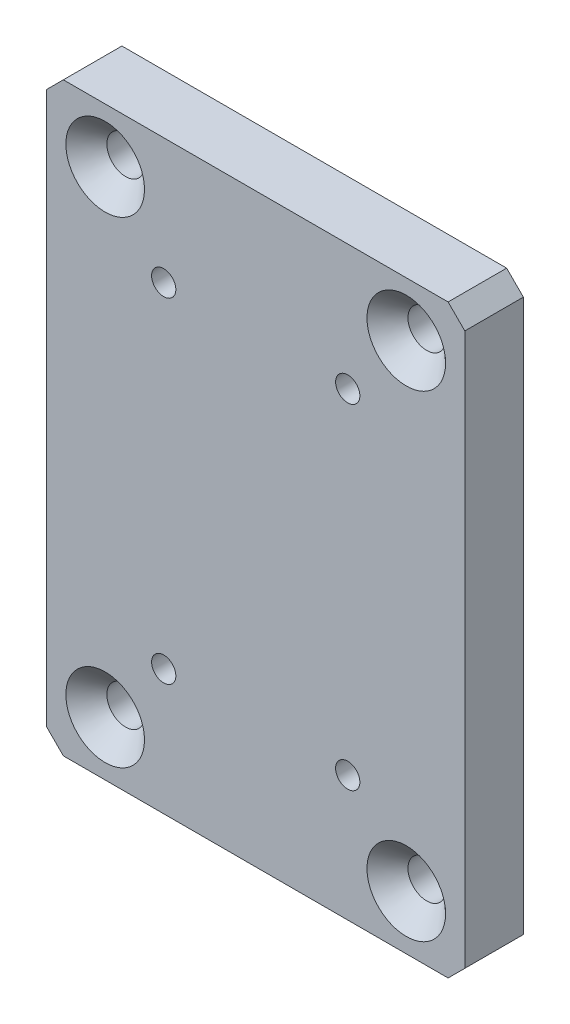
ISO-10303-21;
HEADER;
FILE_DESCRIPTION(('STEP AP214'),'2;1');
FILE_NAME('part.step','',(''),(''),'','','');
FILE_SCHEMA(('AUTOMOTIVE_DESIGN { 1 0 10303 214 1 1 1 1 }'));
ENDSEC;
DATA;
#1=APPLICATION_CONTEXT('core data for automotive mechanical design processes');
#2=APPLICATION_PROTOCOL_DEFINITION('international standard','automotive_design',2000,#1);
#3=PRODUCT_CONTEXT('',#1,'mechanical');
#4=PRODUCT('Part','Part','',(#3));
#5=PRODUCT_RELATED_PRODUCT_CATEGORY('part','',(#4));
#6=PRODUCT_DEFINITION_FORMATION('','',#4);
#7=PRODUCT_DEFINITION_CONTEXT('part definition',#1,'design');
#8=PRODUCT_DEFINITION('design','',#6,#7);
#9=PRODUCT_DEFINITION_SHAPE('','',#8);
#10=(LENGTH_UNIT() NAMED_UNIT(*) SI_UNIT(.MILLI.,.METRE.));
#11=(NAMED_UNIT(*) PLANE_ANGLE_UNIT() SI_UNIT($,.RADIAN.));
#12=(NAMED_UNIT(*) SI_UNIT($,.STERADIAN.) SOLID_ANGLE_UNIT());
#13=UNCERTAINTY_MEASURE_WITH_UNIT(LENGTH_MEASURE(1.E-05),#10,'distance_accuracy_value','');
#14=(GEOMETRIC_REPRESENTATION_CONTEXT(3) GLOBAL_UNCERTAINTY_ASSIGNED_CONTEXT((#13)) GLOBAL_UNIT_ASSIGNED_CONTEXT((#10,
#11,#12)) REPRESENTATION_CONTEXT('',''));
#15=CARTESIAN_POINT('',(0.,0.,0.));
#16=DIRECTION('',(0.,0.,1.));
#17=DIRECTION('',(1.,0.,0.));
#18=AXIS2_PLACEMENT_3D('',#15,#16,#17);
#19=CARTESIAN_POINT('',(0.,0.,7.));
#20=DIRECTION('',(0.,0.,1.));
#21=DIRECTION('',(1.,0.,0.));
#22=AXIS2_PLACEMENT_3D('',#19,#20,#21);
#23=PLANE('',#22);
#24=CARTESIAN_POINT('',(-11.,20.,7.));
#25=DIRECTION('',(0.,0.,-1.));
#26=DIRECTION('',(-1.,0.,0.));
#27=AXIS2_PLACEMENT_3D('',#24,#25,#26);
#28=CIRCLE('',#27,1.45);
#29=CARTESIAN_POINT('',(-12.45,20.,7.));
#30=VERTEX_POINT('',#29);
#31=EDGE_CURVE('E304',#30,#30,#28,.T.);
#32=ORIENTED_EDGE('',*,*,#31,.T.);
#33=EDGE_LOOP('',(#32));
#34=FACE_BOUND('',#33,.T.);
#35=CARTESIAN_POINT('',(11.,20.,7.));
#36=DIRECTION('',(0.,0.,-1.));
#37=DIRECTION('',(-1.,0.,0.));
#38=AXIS2_PLACEMENT_3D('',#35,#36,#37);
#39=CIRCLE('',#38,1.45);
#40=CARTESIAN_POINT('',(9.55,20.,7.));
#41=VERTEX_POINT('',#40);
#42=EDGE_CURVE('E288',#41,#41,#39,.T.);
#43=ORIENTED_EDGE('',*,*,#42,.T.);
#44=EDGE_LOOP('',(#43));
#45=FACE_BOUND('',#44,.T.);
#46=CARTESIAN_POINT('',(11.,-20.,7.));
#47=DIRECTION('',(0.,0.,-1.));
#48=DIRECTION('',(-1.,0.,0.));
#49=AXIS2_PLACEMENT_3D('',#46,#47,#48);
#50=CIRCLE('',#49,1.45);
#51=CARTESIAN_POINT('',(9.55,-20.,7.));
#52=VERTEX_POINT('',#51);
#53=EDGE_CURVE('E272',#52,#52,#50,.T.);
#54=ORIENTED_EDGE('',*,*,#53,.T.);
#55=EDGE_LOOP('',(#54));
#56=FACE_BOUND('',#55,.T.);
#57=CARTESIAN_POINT('',(-11.,-20.,7.));
#58=DIRECTION('',(0.,0.,-1.));
#59=DIRECTION('',(-1.,0.,0.));
#60=AXIS2_PLACEMENT_3D('',#57,#58,#59);
#61=CIRCLE('',#60,1.45);
#62=CARTESIAN_POINT('',(-12.45,-20.,7.));
#63=VERTEX_POINT('',#62);
#64=EDGE_CURVE('E256',#63,#63,#61,.T.);
#65=ORIENTED_EDGE('',*,*,#64,.T.);
#66=EDGE_LOOP('',(#65));
#67=FACE_BOUND('',#66,.T.);
#68=CARTESIAN_POINT('',(18.,28.5,7.));
#69=DIRECTION('',(0.,0.,1.));
#70=DIRECTION('',(1.,0.,0.));
#71=AXIS2_PLACEMENT_3D('',#68,#69,#70);
#72=CIRCLE('',#71,4.7);
#73=CARTESIAN_POINT('',(22.7,28.5,7.));
#74=VERTEX_POINT('',#73);
#75=EDGE_CURVE('E252',#74,#74,#72,.T.);
#76=ORIENTED_EDGE('',*,*,#75,.F.);
#77=EDGE_LOOP('',(#76));
#78=FACE_BOUND('',#77,.T.);
#79=CARTESIAN_POINT('',(18.,-28.5,7.));
#80=DIRECTION('',(0.,0.,1.));
#81=DIRECTION('',(1.,0.,0.));
#82=AXIS2_PLACEMENT_3D('',#79,#80,#81);
#83=CIRCLE('',#82,4.7);
#84=CARTESIAN_POINT('',(22.7,-28.5,7.));
#85=VERTEX_POINT('',#84);
#86=EDGE_CURVE('E240',#85,#85,#83,.T.);
#87=ORIENTED_EDGE('',*,*,#86,.F.);
#88=EDGE_LOOP('',(#87));
#89=FACE_BOUND('',#88,.T.);
#90=CARTESIAN_POINT('',(-18.,-28.5,7.));
#91=DIRECTION('',(0.,0.,1.));
#92=DIRECTION('',(1.,0.,0.));
#93=AXIS2_PLACEMENT_3D('',#90,#91,#92);
#94=CIRCLE('',#93,4.7);
#95=CARTESIAN_POINT('',(-13.3,-28.5,7.));
#96=VERTEX_POINT('',#95);
#97=EDGE_CURVE('E228',#96,#96,#94,.T.);
#98=ORIENTED_EDGE('',*,*,#97,.F.);
#99=EDGE_LOOP('',(#98));
#100=FACE_BOUND('',#99,.T.);
#101=CARTESIAN_POINT('',(-18.,28.5,7.));
#102=DIRECTION('',(0.,0.,1.));
#103=DIRECTION('',(1.,0.,0.));
#104=AXIS2_PLACEMENT_3D('',#101,#102,#103);
#105=CIRCLE('',#104,4.7);
#106=CARTESIAN_POINT('',(-13.3,28.5,7.));
#107=VERTEX_POINT('',#106);
#108=EDGE_CURVE('E216',#107,#107,#105,.T.);
#109=ORIENTED_EDGE('',*,*,#108,.F.);
#110=EDGE_LOOP('',(#109));
#111=FACE_BOUND('',#110,.T.);
#112=DIRECTION('',(0.,1.,0.));
#113=VECTOR('',#112,1.);
#114=CARTESIAN_POINT('',(25.,35.,7.));
#115=LINE('',#114,#113);
#116=CARTESIAN_POINT('',(25.,-33.,7.));
#117=VERTEX_POINT('',#116);
#118=CARTESIAN_POINT('',(25.,33.,7.));
#119=VERTEX_POINT('',#118);
#120=EDGE_CURVE('E203',#117,#119,#115,.T.);
#121=ORIENTED_EDGE('',*,*,#120,.T.);
#122=DIRECTION('',(0.707106781186545,-0.70710678118655,0.));
#123=VECTOR('',#122,1.);
#124=CARTESIAN_POINT('',(29.0000000000001,28.9999999999999,7.));
#125=LINE('',#124,#123);
#126=CARTESIAN_POINT('',(23.,35.,7.));
#127=VERTEX_POINT('',#126);
#128=EDGE_CURVE('E13',#119,#127,#125,.F.);
#129=ORIENTED_EDGE('',*,*,#128,.T.);
#130=DIRECTION('',(-1.,0.,0.));
#131=VECTOR('',#130,1.);
#132=CARTESIAN_POINT('',(-25.,35.,7.));
#133=LINE('',#132,#131);
#134=CARTESIAN_POINT('',(-23.,35.,7.));
#135=VERTEX_POINT('',#134);
#136=EDGE_CURVE('E140',#127,#135,#133,.T.);
#137=ORIENTED_EDGE('',*,*,#136,.T.);
#138=DIRECTION('',(0.707106781186547,0.707106781186548,0.));
#139=VECTOR('',#138,1.);
#140=CARTESIAN_POINT('',(-29.,29.,7.));
#141=LINE('',#140,#139);
#142=CARTESIAN_POINT('',(-25.,33.,7.));
#143=VERTEX_POINT('',#142);
#144=EDGE_CURVE('E167',#135,#143,#141,.F.);
#145=ORIENTED_EDGE('',*,*,#144,.T.);
#146=DIRECTION('',(0.,-1.,0.));
#147=VECTOR('',#146,1.);
#148=CARTESIAN_POINT('',(-25.,35.,7.));
#149=LINE('',#148,#147);
#150=CARTESIAN_POINT('',(-25.,-33.,7.));
#151=VERTEX_POINT('',#150);
#152=EDGE_CURVE('E138',#143,#151,#149,.T.);
#153=ORIENTED_EDGE('',*,*,#152,.T.);
#154=DIRECTION('',(-0.707106781186543,0.707106781186552,0.));
#155=VECTOR('',#154,1.);
#156=CARTESIAN_POINT('',(-29.0000000000002,-28.9999999999998,7.));
#157=LINE('',#156,#155);
#158=CARTESIAN_POINT('',(-23.,-35.,7.));
#159=VERTEX_POINT('',#158);
#160=EDGE_CURVE('E179',#151,#159,#157,.F.);
#161=ORIENTED_EDGE('',*,*,#160,.T.);
#162=DIRECTION('',(1.,0.,0.));
#163=VECTOR('',#162,1.);
#164=CARTESIAN_POINT('',(-25.,-35.,7.));
#165=LINE('',#164,#163);
#166=CARTESIAN_POINT('',(23.,-35.,7.));
#167=VERTEX_POINT('',#166);
#168=EDGE_CURVE('E205',#159,#167,#165,.T.);
#169=ORIENTED_EDGE('',*,*,#168,.T.);
#170=DIRECTION('',(-0.707106781186546,-0.707106781186549,0.));
#171=VECTOR('',#170,1.);
#172=CARTESIAN_POINT('',(29.,-28.9999999999999,7.));
#173=LINE('',#172,#171);
#174=EDGE_CURVE('E192',#167,#117,#173,.F.);
#175=ORIENTED_EDGE('',*,*,#174,.T.);
#176=EDGE_LOOP('',(#121,#129,#137,#145,#153,#161,#169,#175));
#177=FACE_BOUND('',#176,.T.);
#178=ADVANCED_FACE('F53',(#34,#45,#56,#67,#78,#89,#100,#111,#177),#23,.T.);
#179=CARTESIAN_POINT('',(0.,0.,0.));
#180=DIRECTION('',(0.,0.,1.));
#181=DIRECTION('',(1.,0.,0.));
#182=AXIS2_PLACEMENT_3D('',#179,#180,#181);
#183=PLANE('',#182);
#184=CARTESIAN_POINT('',(-11.,20.,0.));
#185=DIRECTION('',(0.,0.,-1.));
#186=DIRECTION('',(-1.,0.,0.));
#187=AXIS2_PLACEMENT_3D('',#184,#185,#186);
#188=CIRCLE('',#187,2.75);
#189=CARTESIAN_POINT('',(-13.75,20.,0.));
#190=VERTEX_POINT('',#189);
#191=EDGE_CURVE('E316',#190,#190,#188,.T.);
#192=ORIENTED_EDGE('',*,*,#191,.F.);
#193=EDGE_LOOP('',(#192));
#194=FACE_BOUND('',#193,.T.);
#195=CARTESIAN_POINT('',(11.,20.,0.));
#196=DIRECTION('',(0.,0.,-1.));
#197=DIRECTION('',(-1.,0.,0.));
#198=AXIS2_PLACEMENT_3D('',#195,#196,#197);
#199=CIRCLE('',#198,2.75);
#200=CARTESIAN_POINT('',(8.25,20.,0.));
#201=VERTEX_POINT('',#200);
#202=EDGE_CURVE('E300',#201,#201,#199,.T.);
#203=ORIENTED_EDGE('',*,*,#202,.F.);
#204=EDGE_LOOP('',(#203));
#205=FACE_BOUND('',#204,.T.);
#206=CARTESIAN_POINT('',(11.,-20.,0.));
#207=DIRECTION('',(0.,0.,-1.));
#208=DIRECTION('',(-1.,0.,0.));
#209=AXIS2_PLACEMENT_3D('',#206,#207,#208);
#210=CIRCLE('',#209,2.75);
#211=CARTESIAN_POINT('',(8.25,-20.,0.));
#212=VERTEX_POINT('',#211);
#213=EDGE_CURVE('E284',#212,#212,#210,.T.);
#214=ORIENTED_EDGE('',*,*,#213,.F.);
#215=EDGE_LOOP('',(#214));
#216=FACE_BOUND('',#215,.T.);
#217=CARTESIAN_POINT('',(-11.,-20.,0.));
#218=DIRECTION('',(0.,0.,-1.));
#219=DIRECTION('',(-1.,0.,0.));
#220=AXIS2_PLACEMENT_3D('',#217,#218,#219);
#221=CIRCLE('',#220,2.75);
#222=CARTESIAN_POINT('',(-13.75,-20.,0.));
#223=VERTEX_POINT('',#222);
#224=EDGE_CURVE('E268',#223,#223,#221,.T.);
#225=ORIENTED_EDGE('',*,*,#224,.F.);
#226=EDGE_LOOP('',(#225));
#227=FACE_BOUND('',#226,.T.);
#228=CARTESIAN_POINT('',(18.,28.5,0.));
#229=DIRECTION('',(0.,0.,1.));
#230=DIRECTION('',(1.,0.,0.));
#231=AXIS2_PLACEMENT_3D('',#228,#229,#230);
#232=CIRCLE('',#231,2.25);
#233=CARTESIAN_POINT('',(20.25,28.5,0.));
#234=VERTEX_POINT('',#233);
#235=EDGE_CURVE('E244',#234,#234,#232,.T.);
#236=ORIENTED_EDGE('',*,*,#235,.T.);
#237=EDGE_LOOP('',(#236));
#238=FACE_BOUND('',#237,.T.);
#239=CARTESIAN_POINT('',(18.,-28.5,0.));
#240=DIRECTION('',(0.,0.,1.));
#241=DIRECTION('',(1.,0.,0.));
#242=AXIS2_PLACEMENT_3D('',#239,#240,#241);
#243=CIRCLE('',#242,2.25);
#244=CARTESIAN_POINT('',(20.25,-28.5,0.));
#245=VERTEX_POINT('',#244);
#246=EDGE_CURVE('E232',#245,#245,#243,.T.);
#247=ORIENTED_EDGE('',*,*,#246,.T.);
#248=EDGE_LOOP('',(#247));
#249=FACE_BOUND('',#248,.T.);
#250=CARTESIAN_POINT('',(-18.,-28.5,0.));
#251=DIRECTION('',(0.,0.,1.));
#252=DIRECTION('',(1.,0.,0.));
#253=AXIS2_PLACEMENT_3D('',#250,#251,#252);
#254=CIRCLE('',#253,2.25);
#255=CARTESIAN_POINT('',(-15.75,-28.5,0.));
#256=VERTEX_POINT('',#255);
#257=EDGE_CURVE('E220',#256,#256,#254,.T.);
#258=ORIENTED_EDGE('',*,*,#257,.T.);
#259=EDGE_LOOP('',(#258));
#260=FACE_BOUND('',#259,.T.);
#261=CARTESIAN_POINT('',(-18.,28.5,0.));
#262=DIRECTION('',(0.,0.,1.));
#263=DIRECTION('',(1.,0.,0.));
#264=AXIS2_PLACEMENT_3D('',#261,#262,#263);
#265=CIRCLE('',#264,2.25);
#266=CARTESIAN_POINT('',(-15.75,28.5,0.));
#267=VERTEX_POINT('',#266);
#268=EDGE_CURVE('E147',#267,#267,#265,.T.);
#269=ORIENTED_EDGE('',*,*,#268,.T.);
#270=EDGE_LOOP('',(#269));
#271=FACE_BOUND('',#270,.T.);
#272=DIRECTION('',(-1.,0.,0.));
#273=VECTOR('',#272,1.);
#274=CARTESIAN_POINT('',(-25.,35.,0.));
#275=LINE('',#274,#273);
#276=CARTESIAN_POINT('',(23.,35.,0.));
#277=VERTEX_POINT('',#276);
#278=CARTESIAN_POINT('',(-23.,35.,0.));
#279=VERTEX_POINT('',#278);
#280=EDGE_CURVE('E162',#277,#279,#275,.T.);
#281=ORIENTED_EDGE('',*,*,#280,.F.);
#282=DIRECTION('',(-0.707106781186545,0.70710678118655,0.));
#283=VECTOR('',#282,1.);
#284=CARTESIAN_POINT('',(23.,35.,0.));
#285=LINE('',#284,#283);
#286=CARTESIAN_POINT('',(25.,33.,0.));
#287=VERTEX_POINT('',#286);
#288=EDGE_CURVE('E77',#277,#287,#285,.F.);
#289=ORIENTED_EDGE('',*,*,#288,.T.);
#290=DIRECTION('',(0.,1.,0.));
#291=VECTOR('',#290,1.);
#292=CARTESIAN_POINT('',(25.,35.,0.));
#293=LINE('',#292,#291);
#294=CARTESIAN_POINT('',(25.,-33.,0.));
#295=VERTEX_POINT('',#294);
#296=EDGE_CURVE('E152',#295,#287,#293,.T.);
#297=ORIENTED_EDGE('',*,*,#296,.F.);
#298=DIRECTION('',(0.707106781186546,0.707106781186549,0.));
#299=VECTOR('',#298,1.);
#300=CARTESIAN_POINT('',(25.,-33.,0.));
#301=LINE('',#300,#299);
#302=CARTESIAN_POINT('',(23.,-35.,0.));
#303=VERTEX_POINT('',#302);
#304=EDGE_CURVE('E186',#295,#303,#301,.F.);
#305=ORIENTED_EDGE('',*,*,#304,.T.);
#306=DIRECTION('',(1.,0.,0.));
#307=VECTOR('',#306,1.);
#308=CARTESIAN_POINT('',(-25.,-35.,0.));
#309=LINE('',#308,#307);
#310=CARTESIAN_POINT('',(-23.,-35.,0.));
#311=VERTEX_POINT('',#310);
#312=EDGE_CURVE('E146',#311,#303,#309,.T.);
#313=ORIENTED_EDGE('',*,*,#312,.F.);
#314=DIRECTION('',(0.707106781186543,-0.707106781186552,0.));
#315=VECTOR('',#314,1.);
#316=CARTESIAN_POINT('',(-23.,-35.,0.));
#317=LINE('',#316,#315);
#318=CARTESIAN_POINT('',(-25.,-33.,0.));
#319=VERTEX_POINT('',#318);
#320=EDGE_CURVE('E144',#311,#319,#317,.F.);
#321=ORIENTED_EDGE('',*,*,#320,.T.);
#322=DIRECTION('',(0.,-1.,0.));
#323=VECTOR('',#322,1.);
#324=CARTESIAN_POINT('',(-25.,35.,0.));
#325=LINE('',#324,#323);
#326=CARTESIAN_POINT('',(-25.,33.,0.));
#327=VERTEX_POINT('',#326);
#328=EDGE_CURVE('E135',#327,#319,#325,.T.);
#329=ORIENTED_EDGE('',*,*,#328,.F.);
#330=DIRECTION('',(-0.707106781186547,-0.707106781186548,0.));
#331=VECTOR('',#330,1.);
#332=CARTESIAN_POINT('',(-25.,33.,0.));
#333=LINE('',#332,#331);
#334=EDGE_CURVE('E121',#327,#279,#333,.F.);
#335=ORIENTED_EDGE('',*,*,#334,.T.);
#336=EDGE_LOOP('',(#281,#289,#297,#305,#313,#321,#329,#335));
#337=FACE_BOUND('',#336,.T.);
#338=ADVANCED_FACE('F142',(#194,#205,#216,#227,#238,#249,#260,#271,#337),#183,.F.);
#339=CARTESIAN_POINT('',(-25.,35.,7.));
#340=DIRECTION('',(1.,0.,0.));
#341=DIRECTION('',(0.,0.,-1.));
#342=AXIS2_PLACEMENT_3D('',#339,#340,#341);
#343=PLANE('',#342);
#344=ORIENTED_EDGE('',*,*,#328,.T.);
#345=DIRECTION('',(0.,0.,1.));
#346=VECTOR('',#345,1.);
#347=CARTESIAN_POINT('',(-25.,-33.,7.));
#348=LINE('',#347,#346);
#349=EDGE_CURVE('E176',#319,#151,#348,.T.);
#350=ORIENTED_EDGE('',*,*,#349,.T.);
#351=ORIENTED_EDGE('',*,*,#152,.F.);
#352=DIRECTION('',(0.,0.,-1.));
#353=VECTOR('',#352,1.);
#354=CARTESIAN_POINT('',(-25.,33.,7.));
#355=LINE('',#354,#353);
#356=EDGE_CURVE('E125',#143,#327,#355,.T.);
#357=ORIENTED_EDGE('',*,*,#356,.T.);
#358=EDGE_LOOP('',(#344,#350,#351,#357));
#359=FACE_BOUND('',#358,.T.);
#360=ADVANCED_FACE('F134',(#359),#343,.F.);
#361=CARTESIAN_POINT('',(-25.,-35.,7.));
#362=DIRECTION('',(0.,1.,0.));
#363=DIRECTION('',(0.,0.,1.));
#364=AXIS2_PLACEMENT_3D('',#361,#362,#363);
#365=PLANE('',#364);
#366=ORIENTED_EDGE('',*,*,#312,.T.);
#367=DIRECTION('',(0.,0.,1.));
#368=VECTOR('',#367,1.);
#369=CARTESIAN_POINT('',(23.,-35.,7.));
#370=LINE('',#369,#368);
#371=EDGE_CURVE('E189',#303,#167,#370,.T.);
#372=ORIENTED_EDGE('',*,*,#371,.T.);
#373=ORIENTED_EDGE('',*,*,#168,.F.);
#374=DIRECTION('',(0.,0.,-1.));
#375=VECTOR('',#374,1.);
#376=CARTESIAN_POINT('',(-23.,-35.,7.));
#377=LINE('',#376,#375);
#378=EDGE_CURVE('E170',#159,#311,#377,.T.);
#379=ORIENTED_EDGE('',*,*,#378,.T.);
#380=EDGE_LOOP('',(#366,#372,#373,#379));
#381=FACE_BOUND('',#380,.T.);
#382=ADVANCED_FACE('F374',(#381),#365,.F.);
#383=CARTESIAN_POINT('',(25.,35.,7.));
#384=DIRECTION('',(-1.,0.,0.));
#385=DIRECTION('',(0.,0.,1.));
#386=AXIS2_PLACEMENT_3D('',#383,#384,#385);
#387=PLANE('',#386);
#388=ORIENTED_EDGE('',*,*,#296,.T.);
#389=DIRECTION('',(0.,0.,1.));
#390=VECTOR('',#389,1.);
#391=CARTESIAN_POINT('',(25.,33.,7.));
#392=LINE('',#391,#390);
#393=EDGE_CURVE('E63',#287,#119,#392,.T.);
#394=ORIENTED_EDGE('',*,*,#393,.T.);
#395=ORIENTED_EDGE('',*,*,#120,.F.);
#396=DIRECTION('',(0.,0.,-1.));
#397=VECTOR('',#396,1.);
#398=CARTESIAN_POINT('',(25.,-33.,7.));
#399=LINE('',#398,#397);
#400=EDGE_CURVE('E182',#117,#295,#399,.T.);
#401=ORIENTED_EDGE('',*,*,#400,.T.);
#402=EDGE_LOOP('',(#388,#394,#395,#401));
#403=FACE_BOUND('',#402,.T.);
#404=ADVANCED_FACE('F365',(#403),#387,.F.);
#405=CARTESIAN_POINT('',(-25.,35.,7.));
#406=DIRECTION('',(0.,-1.,0.));
#407=DIRECTION('',(0.,0.,-1.));
#408=AXIS2_PLACEMENT_3D('',#405,#406,#407);
#409=PLANE('',#408);
#410=ORIENTED_EDGE('',*,*,#136,.F.);
#411=DIRECTION('',(0.,0.,-1.));
#412=VECTOR('',#411,1.);
#413=CARTESIAN_POINT('',(23.,35.,7.));
#414=LINE('',#413,#412);
#415=EDGE_CURVE('E195',#127,#277,#414,.T.);
#416=ORIENTED_EDGE('',*,*,#415,.T.);
#417=ORIENTED_EDGE('',*,*,#280,.T.);
#418=DIRECTION('',(0.,0.,1.));
#419=VECTOR('',#418,1.);
#420=CARTESIAN_POINT('',(-23.,35.,7.));
#421=LINE('',#420,#419);
#422=EDGE_CURVE('E127',#279,#135,#421,.T.);
#423=ORIENTED_EDGE('',*,*,#422,.T.);
#424=EDGE_LOOP('',(#410,#416,#417,#423));
#425=FACE_BOUND('',#424,.T.);
#426=ADVANCED_FACE('F363',(#425),#409,.F.);
#427=CARTESIAN_POINT('',(-25.,33.,7.));
#428=DIRECTION('',(0.707106781186548,-0.707106781186547,0.));
#429=DIRECTION('',(0.,0.,-1.));
#430=AXIS2_PLACEMENT_3D('',#427,#428,#429);
#431=PLANE('',#430);
#432=ORIENTED_EDGE('',*,*,#144,.F.);
#433=ORIENTED_EDGE('',*,*,#422,.F.);
#434=ORIENTED_EDGE('',*,*,#334,.F.);
#435=ORIENTED_EDGE('',*,*,#356,.F.);
#436=EDGE_LOOP('',(#432,#433,#434,#435));
#437=FACE_BOUND('',#436,.T.);
#438=ADVANCED_FACE('F124',(#437),#431,.F.);
#439=CARTESIAN_POINT('',(-23.,-35.,7.));
#440=DIRECTION('',(0.707106781186552,0.707106781186543,0.));
#441=DIRECTION('',(0.,0.,-1.));
#442=AXIS2_PLACEMENT_3D('',#439,#440,#441);
#443=PLANE('',#442);
#444=ORIENTED_EDGE('',*,*,#160,.F.);
#445=ORIENTED_EDGE('',*,*,#349,.F.);
#446=ORIENTED_EDGE('',*,*,#320,.F.);
#447=ORIENTED_EDGE('',*,*,#378,.F.);
#448=EDGE_LOOP('',(#444,#445,#446,#447));
#449=FACE_BOUND('',#448,.T.);
#450=ADVANCED_FACE('F372',(#449),#443,.F.);
#451=CARTESIAN_POINT('',(25.,-33.,7.));
#452=DIRECTION('',(-0.707106781186549,0.707106781186546,0.));
#453=DIRECTION('',(0.,0.,-1.));
#454=AXIS2_PLACEMENT_3D('',#451,#452,#453);
#455=PLANE('',#454);
#456=ORIENTED_EDGE('',*,*,#174,.F.);
#457=ORIENTED_EDGE('',*,*,#371,.F.);
#458=ORIENTED_EDGE('',*,*,#304,.F.);
#459=ORIENTED_EDGE('',*,*,#400,.F.);
#460=EDGE_LOOP('',(#456,#457,#458,#459));
#461=FACE_BOUND('',#460,.T.);
#462=ADVANCED_FACE('F390',(#461),#455,.F.);
#463=CARTESIAN_POINT('',(23.,35.,7.));
#464=DIRECTION('',(-0.70710678118655,-0.707106781186545,0.));
#465=DIRECTION('',(0.,0.,-1.));
#466=AXIS2_PLACEMENT_3D('',#463,#464,#465);
#467=PLANE('',#466);
#468=ORIENTED_EDGE('',*,*,#128,.F.);
#469=ORIENTED_EDGE('',*,*,#393,.F.);
#470=ORIENTED_EDGE('',*,*,#288,.F.);
#471=ORIENTED_EDGE('',*,*,#415,.F.);
#472=EDGE_LOOP('',(#468,#469,#470,#471));
#473=FACE_BOUND('',#472,.T.);
#474=ADVANCED_FACE('F56',(#473),#467,.F.);
#475=CARTESIAN_POINT('',(-18.,28.5,7.));
#476=DIRECTION('',(0.,0.,1.));
#477=DIRECTION('',(1.,0.,0.));
#478=AXIS2_PLACEMENT_3D('',#475,#476,#477);
#479=CYLINDRICAL_SURFACE('',#478,2.25);
#480=ORIENTED_EDGE('',*,*,#268,.F.);
#481=EDGE_LOOP('',(#480));
#482=FACE_BOUND('',#481,.T.);
#483=CARTESIAN_POINT('',(-18.,28.5,4.55));
#484=DIRECTION('',(0.,0.,1.));
#485=DIRECTION('',(1.,0.,0.));
#486=AXIS2_PLACEMENT_3D('',#483,#484,#485);
#487=CIRCLE('',#486,2.25);
#488=CARTESIAN_POINT('',(-15.75,28.5,4.55));
#489=VERTEX_POINT('',#488);
#490=EDGE_CURVE('E155',#489,#489,#487,.T.);
#491=ORIENTED_EDGE('',*,*,#490,.T.);
#492=EDGE_LOOP('',(#491));
#493=FACE_BOUND('',#492,.T.);
#494=ADVANCED_FACE('F340',(#482,#493),#479,.F.);
#495=CARTESIAN_POINT('',(-18.,28.5,7.));
#496=DIRECTION('',(0.,0.,1.));
#497=DIRECTION('',(1.,0.,0.));
#498=AXIS2_PLACEMENT_3D('',#495,#496,#497);
#499=CONICAL_SURFACE('',#498,4.7,0.785398163397448);
#500=ORIENTED_EDGE('',*,*,#490,.F.);
#501=EDGE_LOOP('',(#500));
#502=FACE_BOUND('',#501,.T.);
#503=ORIENTED_EDGE('',*,*,#108,.T.);
#504=EDGE_LOOP('',(#503));
#505=FACE_BOUND('',#504,.T.);
#506=ADVANCED_FACE('F343',(#502,#505),#499,.F.);
#507=CARTESIAN_POINT('',(-18.,-28.5,7.));
#508=DIRECTION('',(0.,0.,1.));
#509=DIRECTION('',(1.,0.,0.));
#510=AXIS2_PLACEMENT_3D('',#507,#508,#509);
#511=CYLINDRICAL_SURFACE('',#510,2.25);
#512=ORIENTED_EDGE('',*,*,#257,.F.);
#513=EDGE_LOOP('',(#512));
#514=FACE_BOUND('',#513,.T.);
#515=CARTESIAN_POINT('',(-18.,-28.5,4.55));
#516=DIRECTION('',(0.,0.,1.));
#517=DIRECTION('',(1.,0.,0.));
#518=AXIS2_PLACEMENT_3D('',#515,#516,#517);
#519=CIRCLE('',#518,2.25);
#520=CARTESIAN_POINT('',(-15.75,-28.5,4.55));
#521=VERTEX_POINT('',#520);
#522=EDGE_CURVE('E224',#521,#521,#519,.T.);
#523=ORIENTED_EDGE('',*,*,#522,.T.);
#524=EDGE_LOOP('',(#523));
#525=FACE_BOUND('',#524,.T.);
#526=ADVANCED_FACE('F349',(#514,#525),#511,.F.);
#527=CARTESIAN_POINT('',(-18.,-28.5,7.));
#528=DIRECTION('',(0.,0.,1.));
#529=DIRECTION('',(1.,0.,0.));
#530=AXIS2_PLACEMENT_3D('',#527,#528,#529);
#531=CONICAL_SURFACE('',#530,4.7,0.785398163397448);
#532=ORIENTED_EDGE('',*,*,#522,.F.);
#533=EDGE_LOOP('',(#532));
#534=FACE_BOUND('',#533,.T.);
#535=ORIENTED_EDGE('',*,*,#97,.T.);
#536=EDGE_LOOP('',(#535));
#537=FACE_BOUND('',#536,.T.);
#538=ADVANCED_FACE('F423',(#534,#537),#531,.F.);
#539=CARTESIAN_POINT('',(18.,-28.5,7.));
#540=DIRECTION('',(0.,0.,1.));
#541=DIRECTION('',(1.,0.,0.));
#542=AXIS2_PLACEMENT_3D('',#539,#540,#541);
#543=CYLINDRICAL_SURFACE('',#542,2.25);
#544=ORIENTED_EDGE('',*,*,#246,.F.);
#545=EDGE_LOOP('',(#544));
#546=FACE_BOUND('',#545,.T.);
#547=CARTESIAN_POINT('',(18.,-28.5,4.55));
#548=DIRECTION('',(0.,0.,1.));
#549=DIRECTION('',(1.,0.,0.));
#550=AXIS2_PLACEMENT_3D('',#547,#548,#549);
#551=CIRCLE('',#550,2.25);
#552=CARTESIAN_POINT('',(20.25,-28.5,4.55));
#553=VERTEX_POINT('',#552);
#554=EDGE_CURVE('E236',#553,#553,#551,.T.);
#555=ORIENTED_EDGE('',*,*,#554,.T.);
#556=EDGE_LOOP('',(#555));
#557=FACE_BOUND('',#556,.T.);
#558=ADVANCED_FACE('F432',(#546,#557),#543,.F.);
#559=CARTESIAN_POINT('',(18.,-28.5,7.));
#560=DIRECTION('',(0.,0.,1.));
#561=DIRECTION('',(1.,0.,0.));
#562=AXIS2_PLACEMENT_3D('',#559,#560,#561);
#563=CONICAL_SURFACE('',#562,4.7,0.785398163397448);
#564=ORIENTED_EDGE('',*,*,#554,.F.);
#565=EDGE_LOOP('',(#564));
#566=FACE_BOUND('',#565,.T.);
#567=ORIENTED_EDGE('',*,*,#86,.T.);
#568=EDGE_LOOP('',(#567));
#569=FACE_BOUND('',#568,.T.);
#570=ADVANCED_FACE('F443',(#566,#569),#563,.F.);
#571=CARTESIAN_POINT('',(18.,28.5,7.));
#572=DIRECTION('',(0.,0.,1.));
#573=DIRECTION('',(1.,0.,0.));
#574=AXIS2_PLACEMENT_3D('',#571,#572,#573);
#575=CYLINDRICAL_SURFACE('',#574,2.25);
#576=ORIENTED_EDGE('',*,*,#235,.F.);
#577=EDGE_LOOP('',(#576));
#578=FACE_BOUND('',#577,.T.);
#579=CARTESIAN_POINT('',(18.,28.5,4.55));
#580=DIRECTION('',(0.,0.,1.));
#581=DIRECTION('',(1.,0.,0.));
#582=AXIS2_PLACEMENT_3D('',#579,#580,#581);
#583=CIRCLE('',#582,2.25);
#584=CARTESIAN_POINT('',(20.25,28.5,4.55));
#585=VERTEX_POINT('',#584);
#586=EDGE_CURVE('E248',#585,#585,#583,.T.);
#587=ORIENTED_EDGE('',*,*,#586,.T.);
#588=EDGE_LOOP('',(#587));
#589=FACE_BOUND('',#588,.T.);
#590=ADVANCED_FACE('F452',(#578,#589),#575,.F.);
#591=CARTESIAN_POINT('',(18.,28.5,7.));
#592=DIRECTION('',(0.,0.,1.));
#593=DIRECTION('',(1.,0.,0.));
#594=AXIS2_PLACEMENT_3D('',#591,#592,#593);
#595=CONICAL_SURFACE('',#594,4.7,0.785398163397448);
#596=ORIENTED_EDGE('',*,*,#586,.F.);
#597=EDGE_LOOP('',(#596));
#598=FACE_BOUND('',#597,.T.);
#599=ORIENTED_EDGE('',*,*,#75,.T.);
#600=EDGE_LOOP('',(#599));
#601=FACE_BOUND('',#600,.T.);
#602=ADVANCED_FACE('F463',(#598,#601),#595,.F.);
#603=CARTESIAN_POINT('',(-11.,-20.,0.));
#604=DIRECTION('',(0.,0.,-1.));
#605=DIRECTION('',(-1.,0.,0.));
#606=AXIS2_PLACEMENT_3D('',#603,#604,#605);
#607=CYLINDRICAL_SURFACE('',#606,1.45);
#608=ORIENTED_EDGE('',*,*,#64,.F.);
#609=EDGE_LOOP('',(#608));
#610=FACE_BOUND('',#609,.T.);
#611=CARTESIAN_POINT('',(-11.,-20.,2.9));
#612=DIRECTION('',(0.,0.,-1.));
#613=DIRECTION('',(-1.,0.,0.));
#614=AXIS2_PLACEMENT_3D('',#611,#612,#613);
#615=CIRCLE('',#614,1.45);
#616=CARTESIAN_POINT('',(-12.45,-20.,2.9));
#617=VERTEX_POINT('',#616);
#618=EDGE_CURVE('E260',#617,#617,#615,.T.);
#619=ORIENTED_EDGE('',*,*,#618,.T.);
#620=EDGE_LOOP('',(#619));
#621=FACE_BOUND('',#620,.T.);
#622=ADVANCED_FACE('F471',(#610,#621),#607,.F.);
#623=CARTESIAN_POINT('',(-9.55,-20.,2.9));
#624=DIRECTION('',(0.,0.,1.));
#625=DIRECTION('',(1.,0.,0.));
#626=AXIS2_PLACEMENT_3D('',#623,#624,#625);
#627=PLANE('',#626);
#628=ORIENTED_EDGE('',*,*,#618,.F.);
#629=EDGE_LOOP('',(#628));
#630=FACE_BOUND('',#629,.T.);
#631=CARTESIAN_POINT('',(-11.,-20.,2.9));
#632=DIRECTION('',(0.,0.,-1.));
#633=DIRECTION('',(-1.,0.,0.));
#634=AXIS2_PLACEMENT_3D('',#631,#632,#633);
#635=CIRCLE('',#634,2.75);
#636=CARTESIAN_POINT('',(-13.75,-20.,2.9));
#637=VERTEX_POINT('',#636);
#638=EDGE_CURVE('E264',#637,#637,#635,.T.);
#639=ORIENTED_EDGE('',*,*,#638,.T.);
#640=EDGE_LOOP('',(#639));
#641=FACE_BOUND('',#640,.T.);
#642=ADVANCED_FACE('F493',(#630,#641),#627,.F.);
#643=CARTESIAN_POINT('',(-11.,-20.,0.));
#644=DIRECTION('',(0.,0.,-1.));
#645=DIRECTION('',(-1.,0.,0.));
#646=AXIS2_PLACEMENT_3D('',#643,#644,#645);
#647=CYLINDRICAL_SURFACE('',#646,2.75);
#648=ORIENTED_EDGE('',*,*,#638,.F.);
#649=EDGE_LOOP('',(#648));
#650=FACE_BOUND('',#649,.T.);
#651=ORIENTED_EDGE('',*,*,#224,.T.);
#652=EDGE_LOOP('',(#651));
#653=FACE_BOUND('',#652,.T.);
#654=ADVANCED_FACE('F502',(#650,#653),#647,.F.);
#655=CARTESIAN_POINT('',(11.,-20.,0.));
#656=DIRECTION('',(0.,0.,-1.));
#657=DIRECTION('',(-1.,0.,0.));
#658=AXIS2_PLACEMENT_3D('',#655,#656,#657);
#659=CYLINDRICAL_SURFACE('',#658,1.45);
#660=ORIENTED_EDGE('',*,*,#53,.F.);
#661=EDGE_LOOP('',(#660));
#662=FACE_BOUND('',#661,.T.);
#663=CARTESIAN_POINT('',(11.,-20.,2.9));
#664=DIRECTION('',(0.,0.,-1.));
#665=DIRECTION('',(-1.,0.,0.));
#666=AXIS2_PLACEMENT_3D('',#663,#664,#665);
#667=CIRCLE('',#666,1.45);
#668=CARTESIAN_POINT('',(9.55,-20.,2.9));
#669=VERTEX_POINT('',#668);
#670=EDGE_CURVE('E276',#669,#669,#667,.T.);
#671=ORIENTED_EDGE('',*,*,#670,.T.);
#672=EDGE_LOOP('',(#671));
#673=FACE_BOUND('',#672,.T.);
#674=ADVANCED_FACE('F511',(#662,#673),#659,.F.);
#675=CARTESIAN_POINT('',(12.45,-20.,2.9));
#676=DIRECTION('',(0.,0.,1.));
#677=DIRECTION('',(1.,0.,0.));
#678=AXIS2_PLACEMENT_3D('',#675,#676,#677);
#679=PLANE('',#678);
#680=ORIENTED_EDGE('',*,*,#670,.F.);
#681=EDGE_LOOP('',(#680));
#682=FACE_BOUND('',#681,.T.);
#683=CARTESIAN_POINT('',(11.,-20.,2.9));
#684=DIRECTION('',(0.,0.,-1.));
#685=DIRECTION('',(-1.,0.,0.));
#686=AXIS2_PLACEMENT_3D('',#683,#684,#685);
#687=CIRCLE('',#686,2.75);
#688=CARTESIAN_POINT('',(8.25,-20.,2.9));
#689=VERTEX_POINT('',#688);
#690=EDGE_CURVE('E280',#689,#689,#687,.T.);
#691=ORIENTED_EDGE('',*,*,#690,.T.);
#692=EDGE_LOOP('',(#691));
#693=FACE_BOUND('',#692,.T.);
#694=ADVANCED_FACE('F520',(#682,#693),#679,.F.);
#695=CARTESIAN_POINT('',(11.,-20.,0.));
#696=DIRECTION('',(0.,0.,-1.));
#697=DIRECTION('',(-1.,0.,0.));
#698=AXIS2_PLACEMENT_3D('',#695,#696,#697);
#699=CYLINDRICAL_SURFACE('',#698,2.75);
#700=ORIENTED_EDGE('',*,*,#690,.F.);
#701=EDGE_LOOP('',(#700));
#702=FACE_BOUND('',#701,.T.);
#703=ORIENTED_EDGE('',*,*,#213,.T.);
#704=EDGE_LOOP('',(#703));
#705=FACE_BOUND('',#704,.T.);
#706=ADVANCED_FACE('F529',(#702,#705),#699,.F.);
#707=CARTESIAN_POINT('',(11.,20.,0.));
#708=DIRECTION('',(0.,0.,-1.));
#709=DIRECTION('',(-1.,0.,0.));
#710=AXIS2_PLACEMENT_3D('',#707,#708,#709);
#711=CYLINDRICAL_SURFACE('',#710,1.45);
#712=ORIENTED_EDGE('',*,*,#42,.F.);
#713=EDGE_LOOP('',(#712));
#714=FACE_BOUND('',#713,.T.);
#715=CARTESIAN_POINT('',(11.,20.,2.9));
#716=DIRECTION('',(0.,0.,-1.));
#717=DIRECTION('',(-1.,0.,0.));
#718=AXIS2_PLACEMENT_3D('',#715,#716,#717);
#719=CIRCLE('',#718,1.45);
#720=CARTESIAN_POINT('',(9.55,20.,2.9));
#721=VERTEX_POINT('',#720);
#722=EDGE_CURVE('E292',#721,#721,#719,.T.);
#723=ORIENTED_EDGE('',*,*,#722,.T.);
#724=EDGE_LOOP('',(#723));
#725=FACE_BOUND('',#724,.T.);
#726=ADVANCED_FACE('F538',(#714,#725),#711,.F.);
#727=CARTESIAN_POINT('',(12.45,20.,2.9));
#728=DIRECTION('',(0.,0.,1.));
#729=DIRECTION('',(1.,0.,0.));
#730=AXIS2_PLACEMENT_3D('',#727,#728,#729);
#731=PLANE('',#730);
#732=ORIENTED_EDGE('',*,*,#722,.F.);
#733=EDGE_LOOP('',(#732));
#734=FACE_BOUND('',#733,.T.);
#735=CARTESIAN_POINT('',(11.,20.,2.9));
#736=DIRECTION('',(0.,0.,-1.));
#737=DIRECTION('',(-1.,0.,0.));
#738=AXIS2_PLACEMENT_3D('',#735,#736,#737);
#739=CIRCLE('',#738,2.75);
#740=CARTESIAN_POINT('',(8.25,20.,2.9));
#741=VERTEX_POINT('',#740);
#742=EDGE_CURVE('E296',#741,#741,#739,.T.);
#743=ORIENTED_EDGE('',*,*,#742,.T.);
#744=EDGE_LOOP('',(#743));
#745=FACE_BOUND('',#744,.T.);
#746=ADVANCED_FACE('F547',(#734,#745),#731,.F.);
#747=CARTESIAN_POINT('',(11.,20.,0.));
#748=DIRECTION('',(0.,0.,-1.));
#749=DIRECTION('',(-1.,0.,0.));
#750=AXIS2_PLACEMENT_3D('',#747,#748,#749);
#751=CYLINDRICAL_SURFACE('',#750,2.75);
#752=ORIENTED_EDGE('',*,*,#742,.F.);
#753=EDGE_LOOP('',(#752));
#754=FACE_BOUND('',#753,.T.);
#755=ORIENTED_EDGE('',*,*,#202,.T.);
#756=EDGE_LOOP('',(#755));
#757=FACE_BOUND('',#756,.T.);
#758=ADVANCED_FACE('F556',(#754,#757),#751,.F.);
#759=CARTESIAN_POINT('',(-11.,20.,0.));
#760=DIRECTION('',(0.,0.,-1.));
#761=DIRECTION('',(-1.,0.,0.));
#762=AXIS2_PLACEMENT_3D('',#759,#760,#761);
#763=CYLINDRICAL_SURFACE('',#762,1.45);
#764=ORIENTED_EDGE('',*,*,#31,.F.);
#765=EDGE_LOOP('',(#764));
#766=FACE_BOUND('',#765,.T.);
#767=CARTESIAN_POINT('',(-11.,20.,2.9));
#768=DIRECTION('',(0.,0.,-1.));
#769=DIRECTION('',(-1.,0.,0.));
#770=AXIS2_PLACEMENT_3D('',#767,#768,#769);
#771=CIRCLE('',#770,1.45);
#772=CARTESIAN_POINT('',(-12.45,20.,2.9));
#773=VERTEX_POINT('',#772);
#774=EDGE_CURVE('E308',#773,#773,#771,.T.);
#775=ORIENTED_EDGE('',*,*,#774,.T.);
#776=EDGE_LOOP('',(#775));
#777=FACE_BOUND('',#776,.T.);
#778=ADVANCED_FACE('F565',(#766,#777),#763,.F.);
#779=CARTESIAN_POINT('',(-9.55,20.,2.9));
#780=DIRECTION('',(0.,0.,1.));
#781=DIRECTION('',(1.,0.,0.));
#782=AXIS2_PLACEMENT_3D('',#779,#780,#781);
#783=PLANE('',#782);
#784=ORIENTED_EDGE('',*,*,#774,.F.);
#785=EDGE_LOOP('',(#784));
#786=FACE_BOUND('',#785,.T.);
#787=CARTESIAN_POINT('',(-11.,20.,2.9));
#788=DIRECTION('',(0.,0.,-1.));
#789=DIRECTION('',(-1.,0.,0.));
#790=AXIS2_PLACEMENT_3D('',#787,#788,#789);
#791=CIRCLE('',#790,2.75);
#792=CARTESIAN_POINT('',(-13.75,20.,2.9));
#793=VERTEX_POINT('',#792);
#794=EDGE_CURVE('E312',#793,#793,#791,.T.);
#795=ORIENTED_EDGE('',*,*,#794,.T.);
#796=EDGE_LOOP('',(#795));
#797=FACE_BOUND('',#796,.T.);
#798=ADVANCED_FACE('F574',(#786,#797),#783,.F.);
#799=CARTESIAN_POINT('',(-11.,20.,0.));
#800=DIRECTION('',(0.,0.,-1.));
#801=DIRECTION('',(-1.,0.,0.));
#802=AXIS2_PLACEMENT_3D('',#799,#800,#801);
#803=CYLINDRICAL_SURFACE('',#802,2.75);
#804=ORIENTED_EDGE('',*,*,#794,.F.);
#805=EDGE_LOOP('',(#804));
#806=FACE_BOUND('',#805,.T.);
#807=ORIENTED_EDGE('',*,*,#191,.T.);
#808=EDGE_LOOP('',(#807));
#809=FACE_BOUND('',#808,.T.);
#810=ADVANCED_FACE('F321',(#806,#809),#803,.F.);
#811=CLOSED_SHELL('',(#178,#338,#360,#382,#404,#426,#438,#450,#462,#474,#494,#506,#526,#538,
#558,#570,#590,#602,#622,#642,#654,#674,#694,#706,#726,#746,#758,#778,#798,#810));
#812=MANIFOLD_SOLID_BREP('B2',#811);
#813=ADVANCED_BREP_SHAPE_REPRESENTATION('',(#18,#812),#14);
#814=SHAPE_DEFINITION_REPRESENTATION(#9,#813);
ENDSEC;
END-ISO-10303-21;
